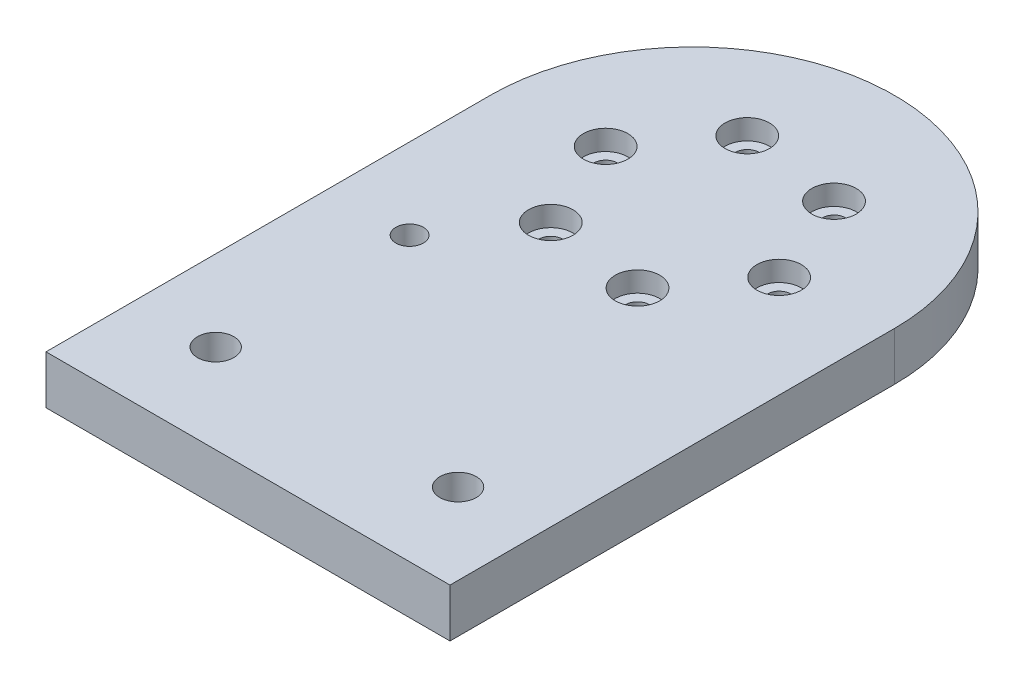
ISO-10303-21;
HEADER;
FILE_DESCRIPTION(('STEP AP214'),'2;1');
FILE_NAME('part.step','',(''),(''),'','','');
FILE_SCHEMA(('AUTOMOTIVE_DESIGN { 1 0 10303 214 1 1 1 1 }'));
ENDSEC;
DATA;
#1=APPLICATION_CONTEXT('core data for automotive mechanical design processes');
#2=APPLICATION_PROTOCOL_DEFINITION('international standard','automotive_design',2000,#1);
#3=PRODUCT_CONTEXT('',#1,'mechanical');
#4=PRODUCT('Part','Part','',(#3));
#5=PRODUCT_RELATED_PRODUCT_CATEGORY('part','',(#4));
#6=PRODUCT_DEFINITION_FORMATION('','',#4);
#7=PRODUCT_DEFINITION_CONTEXT('part definition',#1,'design');
#8=PRODUCT_DEFINITION('design','',#6,#7);
#9=PRODUCT_DEFINITION_SHAPE('','',#8);
#10=(LENGTH_UNIT() NAMED_UNIT(*) SI_UNIT(.MILLI.,.METRE.));
#11=(NAMED_UNIT(*) PLANE_ANGLE_UNIT() SI_UNIT($,.RADIAN.));
#12=(NAMED_UNIT(*) SI_UNIT($,.STERADIAN.) SOLID_ANGLE_UNIT());
#13=UNCERTAINTY_MEASURE_WITH_UNIT(LENGTH_MEASURE(1.E-05),#10,'distance_accuracy_value','');
#14=(GEOMETRIC_REPRESENTATION_CONTEXT(3) GLOBAL_UNCERTAINTY_ASSIGNED_CONTEXT((#13)) GLOBAL_UNIT_ASSIGNED_CONTEXT((#10,
#11,#12)) REPRESENTATION_CONTEXT('',''));
#15=CARTESIAN_POINT('',(0.,0.,0.));
#16=DIRECTION('',(0.,0.,1.));
#17=DIRECTION('',(1.,0.,0.));
#18=AXIS2_PLACEMENT_3D('',#15,#16,#17);
#19=CARTESIAN_POINT('',(4.76337970437843,40.5,501.556825420154));
#20=DIRECTION('',(0.,-1.,0.));
#21=DIRECTION('',(0.,0.,-1.));
#22=AXIS2_PLACEMENT_3D('',#19,#20,#21);
#23=CYLINDRICAL_SURFACE('',#22,1.45);
#24=CARTESIAN_POINT('',(4.76337970437843,34.5,501.556825420154));
#25=DIRECTION('',(0.,1.,0.));
#26=DIRECTION('',(0.,0.,1.));
#27=AXIS2_PLACEMENT_3D('',#24,#25,#26);
#28=CIRCLE('',#27,1.45);
#29=CARTESIAN_POINT('',(4.76337970437843,34.5,503.006825420154));
#30=VERTEX_POINT('',#29);
#31=EDGE_CURVE('E172',#30,#30,#28,.T.);
#32=ORIENTED_EDGE('',*,*,#31,.F.);
#33=EDGE_LOOP('',(#32));
#34=FACE_BOUND('',#33,.T.);
#35=CARTESIAN_POINT('',(4.76337970437843,38.,501.556825420154));
#36=DIRECTION('',(0.,1.,0.));
#37=DIRECTION('',(0.,0.,1.));
#38=AXIS2_PLACEMENT_3D('',#35,#36,#37);
#39=CIRCLE('',#38,1.45);
#40=CARTESIAN_POINT('',(4.76337970437843,38.,503.006825420154));
#41=VERTEX_POINT('',#40);
#42=EDGE_CURVE('E50',#41,#41,#39,.T.);
#43=ORIENTED_EDGE('',*,*,#42,.T.);
#44=EDGE_LOOP('',(#43));
#45=FACE_BOUND('',#44,.T.);
#46=ADVANCED_FACE('F43',(#34,#45),#23,.F.);
#47=CARTESIAN_POINT('',(-7.62681454876585,40.5,499.90362054194));
#48=DIRECTION('',(0.,-1.,0.));
#49=DIRECTION('',(0.,0.,-1.));
#50=AXIS2_PLACEMENT_3D('',#47,#48,#49);
#51=CYLINDRICAL_SURFACE('',#50,1.45);
#52=CARTESIAN_POINT('',(-7.62681454876585,34.5,499.90362054194));
#53=DIRECTION('',(0.,1.,0.));
#54=DIRECTION('',(0.,0.,1.));
#55=AXIS2_PLACEMENT_3D('',#52,#53,#54);
#56=CIRCLE('',#55,1.45);
#57=CARTESIAN_POINT('',(-7.62681454876585,34.5,501.35362054194));
#58=VERTEX_POINT('',#57);
#59=EDGE_CURVE('E181',#58,#58,#56,.T.);
#60=ORIENTED_EDGE('',*,*,#59,.F.);
#61=EDGE_LOOP('',(#60));
#62=FACE_BOUND('',#61,.T.);
#63=CARTESIAN_POINT('',(-7.62681454876585,38.,499.90362054194));
#64=DIRECTION('',(0.,1.,0.));
#65=DIRECTION('',(0.,0.,1.));
#66=AXIS2_PLACEMENT_3D('',#63,#64,#65);
#67=CIRCLE('',#66,1.45);
#68=CARTESIAN_POINT('',(-7.62681454876585,38.,501.35362054194));
#69=VERTEX_POINT('',#68);
#70=EDGE_CURVE('E225',#69,#69,#67,.T.);
#71=ORIENTED_EDGE('',*,*,#70,.T.);
#72=EDGE_LOOP('',(#71));
#73=FACE_BOUND('',#72,.T.);
#74=ADVANCED_FACE('F253',(#62,#73),#51,.F.);
#75=CARTESIAN_POINT('',(-12.3901942531443,40.5,488.346795121786));
#76=DIRECTION('',(0.,-1.,0.));
#77=DIRECTION('',(0.,0.,-1.));
#78=AXIS2_PLACEMENT_3D('',#75,#76,#77);
#79=CYLINDRICAL_SURFACE('',#78,1.45);
#80=CARTESIAN_POINT('',(-12.3901942531443,34.5,488.346795121786));
#81=DIRECTION('',(0.,1.,0.));
#82=DIRECTION('',(0.,0.,1.));
#83=AXIS2_PLACEMENT_3D('',#80,#81,#82);
#84=CIRCLE('',#83,1.45);
#85=CARTESIAN_POINT('',(-12.3901942531443,34.5,489.796795121786));
#86=VERTEX_POINT('',#85);
#87=EDGE_CURVE('E190',#86,#86,#84,.T.);
#88=ORIENTED_EDGE('',*,*,#87,.F.);
#89=EDGE_LOOP('',(#88));
#90=FACE_BOUND('',#89,.T.);
#91=CARTESIAN_POINT('',(-12.3901942531443,38.,488.346795121786));
#92=DIRECTION('',(0.,1.,0.));
#93=DIRECTION('',(0.,0.,1.));
#94=AXIS2_PLACEMENT_3D('',#91,#92,#93);
#95=CIRCLE('',#94,1.45);
#96=CARTESIAN_POINT('',(-12.3901942531443,38.,489.796795121786));
#97=VERTEX_POINT('',#96);
#98=EDGE_CURVE('E218',#97,#97,#95,.T.);
#99=ORIENTED_EDGE('',*,*,#98,.T.);
#100=EDGE_LOOP('',(#99));
#101=FACE_BOUND('',#100,.T.);
#102=ADVANCED_FACE('F258',(#90,#101),#79,.F.);
#103=CARTESIAN_POINT('',(-4.76337970437842,40.5,478.443174579846));
#104=DIRECTION('',(0.,-1.,0.));
#105=DIRECTION('',(0.,0.,-1.));
#106=AXIS2_PLACEMENT_3D('',#103,#104,#105);
#107=CYLINDRICAL_SURFACE('',#106,1.45);
#108=CARTESIAN_POINT('',(-4.76337970437842,34.5,478.443174579846));
#109=DIRECTION('',(0.,1.,0.));
#110=DIRECTION('',(0.,0.,1.));
#111=AXIS2_PLACEMENT_3D('',#108,#109,#110);
#112=CIRCLE('',#111,1.45);
#113=CARTESIAN_POINT('',(-4.76337970437842,34.5,479.893174579846));
#114=VERTEX_POINT('',#113);
#115=EDGE_CURVE('E179',#114,#114,#112,.T.);
#116=ORIENTED_EDGE('',*,*,#115,.F.);
#117=EDGE_LOOP('',(#116));
#118=FACE_BOUND('',#117,.T.);
#119=CARTESIAN_POINT('',(-4.76337970437842,38.,478.443174579846));
#120=DIRECTION('',(0.,1.,0.));
#121=DIRECTION('',(0.,0.,1.));
#122=AXIS2_PLACEMENT_3D('',#119,#120,#121);
#123=CIRCLE('',#122,1.45);
#124=CARTESIAN_POINT('',(-4.76337970437842,38.,479.893174579846));
#125=VERTEX_POINT('',#124);
#126=EDGE_CURVE('E214',#125,#125,#123,.T.);
#127=ORIENTED_EDGE('',*,*,#126,.T.);
#128=EDGE_LOOP('',(#127));
#129=FACE_BOUND('',#128,.T.);
#130=ADVANCED_FACE('F266',(#118,#129),#107,.F.);
#131=CARTESIAN_POINT('',(7.62681454876585,40.5,480.09637945806));
#132=DIRECTION('',(0.,-1.,0.));
#133=DIRECTION('',(0.,0.,-1.));
#134=AXIS2_PLACEMENT_3D('',#131,#132,#133);
#135=CYLINDRICAL_SURFACE('',#134,1.45);
#136=CARTESIAN_POINT('',(7.62681454876585,34.5,480.09637945806));
#137=DIRECTION('',(0.,1.,0.));
#138=DIRECTION('',(0.,0.,1.));
#139=AXIS2_PLACEMENT_3D('',#136,#137,#138);
#140=CIRCLE('',#139,1.45);
#141=CARTESIAN_POINT('',(7.62681454876585,34.5,481.54637945806));
#142=VERTEX_POINT('',#141);
#143=EDGE_CURVE('E178',#142,#142,#140,.T.);
#144=ORIENTED_EDGE('',*,*,#143,.F.);
#145=EDGE_LOOP('',(#144));
#146=FACE_BOUND('',#145,.T.);
#147=CARTESIAN_POINT('',(7.62681454876585,38.,480.09637945806));
#148=DIRECTION('',(0.,1.,0.));
#149=DIRECTION('',(0.,0.,1.));
#150=AXIS2_PLACEMENT_3D('',#147,#148,#149);
#151=CIRCLE('',#150,1.45);
#152=CARTESIAN_POINT('',(7.62681454876585,38.,481.54637945806));
#153=VERTEX_POINT('',#152);
#154=EDGE_CURVE('E211',#153,#153,#151,.T.);
#155=ORIENTED_EDGE('',*,*,#154,.T.);
#156=EDGE_LOOP('',(#155));
#157=FACE_BOUND('',#156,.T.);
#158=ADVANCED_FACE('F261',(#146,#157),#135,.F.);
#159=CARTESIAN_POINT('',(12.3901942531443,40.5,491.653204878214));
#160=DIRECTION('',(0.,-1.,0.));
#161=DIRECTION('',(0.,0.,-1.));
#162=AXIS2_PLACEMENT_3D('',#159,#160,#161);
#163=CYLINDRICAL_SURFACE('',#162,1.45);
#164=CARTESIAN_POINT('',(12.3901942531443,34.5,491.653204878214));
#165=DIRECTION('',(0.,1.,0.));
#166=DIRECTION('',(0.,0.,1.));
#167=AXIS2_PLACEMENT_3D('',#164,#165,#166);
#168=CIRCLE('',#167,1.45);
#169=CARTESIAN_POINT('',(12.3901942531443,34.5,493.103204878214));
#170=VERTEX_POINT('',#169);
#171=EDGE_CURVE('E173',#170,#170,#168,.T.);
#172=ORIENTED_EDGE('',*,*,#171,.F.);
#173=EDGE_LOOP('',(#172));
#174=FACE_BOUND('',#173,.T.);
#175=CARTESIAN_POINT('',(12.3901942531443,38.,491.653204878214));
#176=DIRECTION('',(0.,1.,0.));
#177=DIRECTION('',(0.,0.,1.));
#178=AXIS2_PLACEMENT_3D('',#175,#176,#177);
#179=CIRCLE('',#178,1.45);
#180=CARTESIAN_POINT('',(12.3901942531443,38.,493.103204878214));
#181=VERTEX_POINT('',#180);
#182=EDGE_CURVE('E170',#181,#181,#179,.T.);
#183=ORIENTED_EDGE('',*,*,#182,.T.);
#184=EDGE_LOOP('',(#183));
#185=FACE_BOUND('',#184,.T.);
#186=ADVANCED_FACE('F284',(#174,#185),#163,.F.);
#187=CARTESIAN_POINT('',(25.,40.5,526.));
#188=DIRECTION('',(-1.,0.,0.));
#189=DIRECTION('',(0.,0.,1.));
#190=AXIS2_PLACEMENT_3D('',#187,#188,#189);
#191=PLANE('',#190);
#192=DIRECTION('',(0.,0.,-1.));
#193=VECTOR('',#192,1.);
#194=CARTESIAN_POINT('',(25.,34.5,526.));
#195=LINE('',#194,#193);
#196=CARTESIAN_POINT('',(25.,34.5,545.));
#197=VERTEX_POINT('',#196);
#198=CARTESIAN_POINT('',(25.,34.5,490.));
#199=VERTEX_POINT('',#198);
#200=EDGE_CURVE('E198',#197,#199,#195,.T.);
#201=ORIENTED_EDGE('',*,*,#200,.T.);
#202=DIRECTION('',(0.,-1.,0.));
#203=VECTOR('',#202,1.);
#204=CARTESIAN_POINT('',(25.,40.5,490.));
#205=LINE('',#204,#203);
#206=CARTESIAN_POINT('',(25.,40.5,490.));
#207=VERTEX_POINT('',#206);
#208=EDGE_CURVE('E11',#207,#199,#205,.T.);
#209=ORIENTED_EDGE('',*,*,#208,.F.);
#210=DIRECTION('',(0.,0.,-1.));
#211=VECTOR('',#210,1.);
#212=CARTESIAN_POINT('',(25.,40.5,526.));
#213=LINE('',#212,#211);
#214=CARTESIAN_POINT('',(25.,40.5,545.));
#215=VERTEX_POINT('',#214);
#216=EDGE_CURVE('E94',#215,#207,#213,.T.);
#217=ORIENTED_EDGE('',*,*,#216,.F.);
#218=DIRECTION('',(0.,-1.,0.));
#219=VECTOR('',#218,1.);
#220=CARTESIAN_POINT('',(25.,40.5,545.));
#221=LINE('',#220,#219);
#222=EDGE_CURVE('E106',#215,#197,#221,.T.);
#223=ORIENTED_EDGE('',*,*,#222,.T.);
#224=EDGE_LOOP('',(#201,#209,#217,#223));
#225=FACE_BOUND('',#224,.T.);
#226=ADVANCED_FACE('F44',(#225),#191,.F.);
#227=CARTESIAN_POINT('',(-25.,40.5,526.));
#228=DIRECTION('',(1.,0.,0.));
#229=DIRECTION('',(0.,0.,-1.));
#230=AXIS2_PLACEMENT_3D('',#227,#228,#229);
#231=PLANE('',#230);
#232=DIRECTION('',(0.,0.,1.));
#233=VECTOR('',#232,1.);
#234=CARTESIAN_POINT('',(-25.,34.5,526.));
#235=LINE('',#234,#233);
#236=CARTESIAN_POINT('',(-25.,34.5,490.));
#237=VERTEX_POINT('',#236);
#238=CARTESIAN_POINT('',(-25.,34.5,545.));
#239=VERTEX_POINT('',#238);
#240=EDGE_CURVE('E99',#237,#239,#235,.T.);
#241=ORIENTED_EDGE('',*,*,#240,.T.);
#242=DIRECTION('',(0.,-1.,0.));
#243=VECTOR('',#242,1.);
#244=CARTESIAN_POINT('',(-25.,40.5,545.));
#245=LINE('',#244,#243);
#246=CARTESIAN_POINT('',(-25.,40.5,545.));
#247=VERTEX_POINT('',#246);
#248=EDGE_CURVE('E100',#247,#239,#245,.T.);
#249=ORIENTED_EDGE('',*,*,#248,.F.);
#250=DIRECTION('',(0.,0.,1.));
#251=VECTOR('',#250,1.);
#252=CARTESIAN_POINT('',(-25.,40.5,526.));
#253=LINE('',#252,#251);
#254=CARTESIAN_POINT('',(-25.,40.5,490.));
#255=VERTEX_POINT('',#254);
#256=EDGE_CURVE('E84',#255,#247,#253,.T.);
#257=ORIENTED_EDGE('',*,*,#256,.F.);
#258=DIRECTION('',(0.,-1.,0.));
#259=VECTOR('',#258,1.);
#260=CARTESIAN_POINT('',(-25.,40.5,490.));
#261=LINE('',#260,#259);
#262=EDGE_CURVE('E52',#255,#237,#261,.T.);
#263=ORIENTED_EDGE('',*,*,#262,.T.);
#264=EDGE_LOOP('',(#241,#249,#257,#263));
#265=FACE_BOUND('',#264,.T.);
#266=ADVANCED_FACE('F98',(#265),#231,.F.);
#267=CARTESIAN_POINT('',(0.,40.5,0.));
#268=DIRECTION('',(0.,-1.,0.));
#269=DIRECTION('',(0.,0.,-1.));
#270=AXIS2_PLACEMENT_3D('',#267,#268,#269);
#271=PLANE('',#270);
#272=CARTESIAN_POINT('',(-15.,40.5,510.));
#273=DIRECTION('',(0.,1.,0.));
#274=DIRECTION('',(0.,0.,1.));
#275=AXIS2_PLACEMENT_3D('',#272,#273,#274);
#276=CIRCLE('',#275,1.7);
#277=CARTESIAN_POINT('',(-15.,40.5,511.7));
#278=VERTEX_POINT('',#277);
#279=EDGE_CURVE('E366',#278,#278,#276,.T.);
#280=ORIENTED_EDGE('',*,*,#279,.F.);
#281=EDGE_LOOP('',(#280));
#282=FACE_BOUND('',#281,.T.);
#283=CARTESIAN_POINT('',(-15.,40.5,534.));
#284=DIRECTION('',(0.,1.,0.));
#285=DIRECTION('',(0.,0.,1.));
#286=AXIS2_PLACEMENT_3D('',#283,#284,#285);
#287=CIRCLE('',#286,2.25);
#288=CARTESIAN_POINT('',(-15.,40.5,536.25));
#289=VERTEX_POINT('',#288);
#290=EDGE_CURVE('E116',#289,#289,#287,.T.);
#291=ORIENTED_EDGE('',*,*,#290,.F.);
#292=EDGE_LOOP('',(#291));
#293=FACE_BOUND('',#292,.T.);
#294=CARTESIAN_POINT('',(15.,40.5,534.));
#295=DIRECTION('',(0.,1.,0.));
#296=DIRECTION('',(0.,0.,1.));
#297=AXIS2_PLACEMENT_3D('',#294,#295,#296);
#298=CIRCLE('',#297,2.25);
#299=CARTESIAN_POINT('',(15.,40.5,536.25));
#300=VERTEX_POINT('',#299);
#301=EDGE_CURVE('E123',#300,#300,#298,.T.);
#302=ORIENTED_EDGE('',*,*,#301,.F.);
#303=EDGE_LOOP('',(#302));
#304=FACE_BOUND('',#303,.T.);
#305=CARTESIAN_POINT('',(4.76337970437843,40.5,501.556825420154));
#306=DIRECTION('',(0.,1.,0.));
#307=DIRECTION('',(0.,0.,1.));
#308=AXIS2_PLACEMENT_3D('',#305,#306,#307);
#309=CIRCLE('',#308,2.75);
#310=CARTESIAN_POINT('',(4.76337970437843,40.5,504.306825420154));
#311=VERTEX_POINT('',#310);
#312=EDGE_CURVE('E140',#311,#311,#309,.T.);
#313=ORIENTED_EDGE('',*,*,#312,.F.);
#314=EDGE_LOOP('',(#313));
#315=FACE_BOUND('',#314,.T.);
#316=CARTESIAN_POINT('',(-7.62681454876585,40.5,499.90362054194));
#317=DIRECTION('',(0.,1.,0.));
#318=DIRECTION('',(0.,0.,1.));
#319=AXIS2_PLACEMENT_3D('',#316,#317,#318);
#320=CIRCLE('',#319,2.75);
#321=CARTESIAN_POINT('',(-7.62681454876585,40.5,502.65362054194));
#322=VERTEX_POINT('',#321);
#323=EDGE_CURVE('E144',#322,#322,#320,.T.);
#324=ORIENTED_EDGE('',*,*,#323,.F.);
#325=EDGE_LOOP('',(#324));
#326=FACE_BOUND('',#325,.T.);
#327=CARTESIAN_POINT('',(-12.3901942531443,40.5,488.346795121786));
#328=DIRECTION('',(0.,1.,0.));
#329=DIRECTION('',(0.,0.,1.));
#330=AXIS2_PLACEMENT_3D('',#327,#328,#329);
#331=CIRCLE('',#330,2.75);
#332=CARTESIAN_POINT('',(-12.3901942531443,40.5,491.096795121786));
#333=VERTEX_POINT('',#332);
#334=EDGE_CURVE('E153',#333,#333,#331,.T.);
#335=ORIENTED_EDGE('',*,*,#334,.F.);
#336=EDGE_LOOP('',(#335));
#337=FACE_BOUND('',#336,.T.);
#338=CARTESIAN_POINT('',(-4.76337970437842,40.5,478.443174579846));
#339=DIRECTION('',(0.,1.,0.));
#340=DIRECTION('',(0.,0.,1.));
#341=AXIS2_PLACEMENT_3D('',#338,#339,#340);
#342=CIRCLE('',#341,2.75);
#343=CARTESIAN_POINT('',(-4.76337970437842,40.5,481.193174579846));
#344=VERTEX_POINT('',#343);
#345=EDGE_CURVE('E126',#344,#344,#342,.T.);
#346=ORIENTED_EDGE('',*,*,#345,.F.);
#347=EDGE_LOOP('',(#346));
#348=FACE_BOUND('',#347,.T.);
#349=CARTESIAN_POINT('',(7.62681454876585,40.5,480.09637945806));
#350=DIRECTION('',(0.,1.,0.));
#351=DIRECTION('',(0.,0.,1.));
#352=AXIS2_PLACEMENT_3D('',#349,#350,#351);
#353=CIRCLE('',#352,2.75);
#354=CARTESIAN_POINT('',(7.62681454876585,40.5,482.84637945806));
#355=VERTEX_POINT('',#354);
#356=EDGE_CURVE('E104',#355,#355,#353,.T.);
#357=ORIENTED_EDGE('',*,*,#356,.F.);
#358=EDGE_LOOP('',(#357));
#359=FACE_BOUND('',#358,.T.);
#360=CARTESIAN_POINT('',(12.3901942531443,40.5,491.653204878214));
#361=DIRECTION('',(0.,1.,0.));
#362=DIRECTION('',(0.,0.,1.));
#363=AXIS2_PLACEMENT_3D('',#360,#361,#362);
#364=CIRCLE('',#363,2.75);
#365=CARTESIAN_POINT('',(12.3901942531443,40.5,494.403204878214));
#366=VERTEX_POINT('',#365);
#367=EDGE_CURVE('E162',#366,#366,#364,.T.);
#368=ORIENTED_EDGE('',*,*,#367,.F.);
#369=EDGE_LOOP('',(#368));
#370=FACE_BOUND('',#369,.T.);
#371=ORIENTED_EDGE('',*,*,#216,.T.);
#372=CARTESIAN_POINT('',(0.,40.5,490.));
#373=DIRECTION('',(0.,1.,0.));
#374=DIRECTION('',(0.,0.,1.));
#375=AXIS2_PLACEMENT_3D('',#372,#373,#374);
#376=CIRCLE('',#375,25.);
#377=EDGE_CURVE('E93',#207,#255,#376,.T.);
#378=ORIENTED_EDGE('',*,*,#377,.T.);
#379=ORIENTED_EDGE('',*,*,#256,.T.);
#380=DIRECTION('',(1.,0.,0.));
#381=VECTOR('',#380,1.);
#382=CARTESIAN_POINT('',(-25.,40.5,545.));
#383=LINE('',#382,#381);
#384=EDGE_CURVE('E90',#247,#215,#383,.T.);
#385=ORIENTED_EDGE('',*,*,#384,.T.);
#386=EDGE_LOOP('',(#371,#378,#379,#385));
#387=FACE_BOUND('',#386,.T.);
#388=ADVANCED_FACE('F87',(#282,#293,#304,#315,#326,#337,#348,#359,#370,#387),#271,.F.);
#389=CARTESIAN_POINT('',(0.,34.5,0.));
#390=DIRECTION('',(0.,-1.,0.));
#391=DIRECTION('',(0.,0.,-1.));
#392=AXIS2_PLACEMENT_3D('',#389,#390,#391);
#393=PLANE('',#392);
#394=CARTESIAN_POINT('',(-15.,34.5,510.));
#395=DIRECTION('',(0.,1.,0.));
#396=DIRECTION('',(0.,0.,1.));
#397=AXIS2_PLACEMENT_3D('',#394,#395,#396);
#398=CIRCLE('',#397,1.7);
#399=CARTESIAN_POINT('',(-15.,34.5,511.7));
#400=VERTEX_POINT('',#399);
#401=EDGE_CURVE('E371',#400,#400,#398,.T.);
#402=ORIENTED_EDGE('',*,*,#401,.T.);
#403=EDGE_LOOP('',(#402));
#404=FACE_BOUND('',#403,.T.);
#405=CARTESIAN_POINT('',(-15.,34.5,534.));
#406=DIRECTION('',(0.,1.,0.));
#407=DIRECTION('',(0.,0.,1.));
#408=AXIS2_PLACEMENT_3D('',#405,#406,#407);
#409=CIRCLE('',#408,2.25);
#410=CARTESIAN_POINT('',(-15.,34.5,536.25));
#411=VERTEX_POINT('',#410);
#412=EDGE_CURVE('E379',#411,#411,#409,.T.);
#413=ORIENTED_EDGE('',*,*,#412,.T.);
#414=EDGE_LOOP('',(#413));
#415=FACE_BOUND('',#414,.T.);
#416=CARTESIAN_POINT('',(15.,34.5,534.));
#417=DIRECTION('',(0.,1.,0.));
#418=DIRECTION('',(0.,0.,1.));
#419=AXIS2_PLACEMENT_3D('',#416,#417,#418);
#420=CIRCLE('',#419,2.25);
#421=CARTESIAN_POINT('',(15.,34.5,536.25));
#422=VERTEX_POINT('',#421);
#423=EDGE_CURVE('E382',#422,#422,#420,.T.);
#424=ORIENTED_EDGE('',*,*,#423,.T.);
#425=EDGE_LOOP('',(#424));
#426=FACE_BOUND('',#425,.T.);
#427=ORIENTED_EDGE('',*,*,#171,.T.);
#428=EDGE_LOOP('',(#427));
#429=FACE_BOUND('',#428,.T.);
#430=ORIENTED_EDGE('',*,*,#143,.T.);
#431=EDGE_LOOP('',(#430));
#432=FACE_BOUND('',#431,.T.);
#433=ORIENTED_EDGE('',*,*,#115,.T.);
#434=EDGE_LOOP('',(#433));
#435=FACE_BOUND('',#434,.T.);
#436=ORIENTED_EDGE('',*,*,#87,.T.);
#437=EDGE_LOOP('',(#436));
#438=FACE_BOUND('',#437,.T.);
#439=ORIENTED_EDGE('',*,*,#59,.T.);
#440=EDGE_LOOP('',(#439));
#441=FACE_BOUND('',#440,.T.);
#442=ORIENTED_EDGE('',*,*,#31,.T.);
#443=EDGE_LOOP('',(#442));
#444=FACE_BOUND('',#443,.T.);
#445=ORIENTED_EDGE('',*,*,#240,.F.);
#446=CARTESIAN_POINT('',(0.,34.5,490.));
#447=DIRECTION('',(0.,1.,0.));
#448=DIRECTION('',(0.,0.,1.));
#449=AXIS2_PLACEMENT_3D('',#446,#447,#448);
#450=CIRCLE('',#449,25.);
#451=EDGE_CURVE('E58',#199,#237,#450,.T.);
#452=ORIENTED_EDGE('',*,*,#451,.F.);
#453=ORIENTED_EDGE('',*,*,#200,.F.);
#454=DIRECTION('',(1.,0.,0.));
#455=VECTOR('',#454,1.);
#456=CARTESIAN_POINT('',(-25.,34.5,545.));
#457=LINE('',#456,#455);
#458=EDGE_CURVE('E112',#239,#197,#457,.T.);
#459=ORIENTED_EDGE('',*,*,#458,.F.);
#460=EDGE_LOOP('',(#445,#452,#453,#459));
#461=FACE_BOUND('',#460,.T.);
#462=ADVANCED_FACE('F274',(#404,#415,#426,#429,#432,#435,#438,#441,#444,#461),#393,.T.);
#463=CARTESIAN_POINT('',(0.,40.5,490.));
#464=DIRECTION('',(0.,-1.,0.));
#465=DIRECTION('',(0.,0.,-1.));
#466=AXIS2_PLACEMENT_3D('',#463,#464,#465);
#467=CYLINDRICAL_SURFACE('',#466,25.);
#468=ORIENTED_EDGE('',*,*,#377,.F.);
#469=ORIENTED_EDGE('',*,*,#208,.T.);
#470=ORIENTED_EDGE('',*,*,#451,.T.);
#471=ORIENTED_EDGE('',*,*,#262,.F.);
#472=EDGE_LOOP('',(#468,#469,#470,#471));
#473=FACE_BOUND('',#472,.T.);
#474=ADVANCED_FACE('F271',(#473),#467,.T.);
#475=CARTESIAN_POINT('',(12.3901942531443,40.5,491.653204878214));
#476=DIRECTION('',(0.,-1.,0.));
#477=DIRECTION('',(0.,0.,-1.));
#478=AXIS2_PLACEMENT_3D('',#475,#476,#477);
#479=CYLINDRICAL_SURFACE('',#478,2.75);
#480=ORIENTED_EDGE('',*,*,#367,.T.);
#481=EDGE_LOOP('',(#480));
#482=FACE_BOUND('',#481,.T.);
#483=CARTESIAN_POINT('',(12.3901942531443,38.,491.653204878214));
#484=DIRECTION('',(0.,1.,0.));
#485=DIRECTION('',(0.,0.,1.));
#486=AXIS2_PLACEMENT_3D('',#483,#484,#485);
#487=CIRCLE('',#486,2.75);
#488=CARTESIAN_POINT('',(12.3901942531443,38.,494.403204878214));
#489=VERTEX_POINT('',#488);
#490=EDGE_CURVE('E138',#489,#489,#487,.T.);
#491=ORIENTED_EDGE('',*,*,#490,.F.);
#492=EDGE_LOOP('',(#491));
#493=FACE_BOUND('',#492,.T.);
#494=ADVANCED_FACE('F273',(#482,#493),#479,.F.);
#495=CARTESIAN_POINT('',(12.3901942531443,38.,491.653204878214));
#496=DIRECTION('',(0.,1.,0.));
#497=DIRECTION('',(0.,0.,1.));
#498=AXIS2_PLACEMENT_3D('',#495,#496,#497);
#499=PLANE('',#498);
#500=ORIENTED_EDGE('',*,*,#182,.F.);
#501=EDGE_LOOP('',(#500));
#502=FACE_BOUND('',#501,.T.);
#503=ORIENTED_EDGE('',*,*,#490,.T.);
#504=EDGE_LOOP('',(#503));
#505=FACE_BOUND('',#504,.T.);
#506=ADVANCED_FACE('F296',(#502,#505),#499,.T.);
#507=CARTESIAN_POINT('',(7.62681454876585,40.5,480.09637945806));
#508=DIRECTION('',(0.,-1.,0.));
#509=DIRECTION('',(0.,0.,-1.));
#510=AXIS2_PLACEMENT_3D('',#507,#508,#509);
#511=CYLINDRICAL_SURFACE('',#510,2.75);
#512=ORIENTED_EDGE('',*,*,#356,.T.);
#513=EDGE_LOOP('',(#512));
#514=FACE_BOUND('',#513,.T.);
#515=CARTESIAN_POINT('',(7.62681454876585,38.,480.09637945806));
#516=DIRECTION('',(0.,1.,0.));
#517=DIRECTION('',(0.,0.,1.));
#518=AXIS2_PLACEMENT_3D('',#515,#516,#517);
#519=CIRCLE('',#518,2.75);
#520=CARTESIAN_POINT('',(7.62681454876585,38.,482.84637945806));
#521=VERTEX_POINT('',#520);
#522=EDGE_CURVE('E124',#521,#521,#519,.T.);
#523=ORIENTED_EDGE('',*,*,#522,.F.);
#524=EDGE_LOOP('',(#523));
#525=FACE_BOUND('',#524,.T.);
#526=ADVANCED_FACE('F305',(#514,#525),#511,.F.);
#527=CARTESIAN_POINT('',(7.62681454876585,38.,480.09637945806));
#528=DIRECTION('',(0.,1.,0.));
#529=DIRECTION('',(0.,0.,1.));
#530=AXIS2_PLACEMENT_3D('',#527,#528,#529);
#531=PLANE('',#530);
#532=ORIENTED_EDGE('',*,*,#154,.F.);
#533=EDGE_LOOP('',(#532));
#534=FACE_BOUND('',#533,.T.);
#535=ORIENTED_EDGE('',*,*,#522,.T.);
#536=EDGE_LOOP('',(#535));
#537=FACE_BOUND('',#536,.T.);
#538=ADVANCED_FACE('F315',(#534,#537),#531,.T.);
#539=CARTESIAN_POINT('',(-4.76337970437842,40.5,478.443174579846));
#540=DIRECTION('',(0.,-1.,0.));
#541=DIRECTION('',(0.,0.,-1.));
#542=AXIS2_PLACEMENT_3D('',#539,#540,#541);
#543=CYLINDRICAL_SURFACE('',#542,2.75);
#544=ORIENTED_EDGE('',*,*,#345,.T.);
#545=EDGE_LOOP('',(#544));
#546=FACE_BOUND('',#545,.T.);
#547=CARTESIAN_POINT('',(-4.76337970437842,38.,478.443174579846));
#548=DIRECTION('',(0.,1.,0.));
#549=DIRECTION('',(0.,0.,1.));
#550=AXIS2_PLACEMENT_3D('',#547,#548,#549);
#551=CIRCLE('',#550,2.75);
#552=CARTESIAN_POINT('',(-4.76337970437842,38.,481.193174579846));
#553=VERTEX_POINT('',#552);
#554=EDGE_CURVE('E160',#553,#553,#551,.T.);
#555=ORIENTED_EDGE('',*,*,#554,.F.);
#556=EDGE_LOOP('',(#555));
#557=FACE_BOUND('',#556,.T.);
#558=ADVANCED_FACE('F306',(#546,#557),#543,.F.);
#559=CARTESIAN_POINT('',(-4.76337970437842,38.,478.443174579846));
#560=DIRECTION('',(0.,1.,0.));
#561=DIRECTION('',(0.,0.,1.));
#562=AXIS2_PLACEMENT_3D('',#559,#560,#561);
#563=PLANE('',#562);
#564=ORIENTED_EDGE('',*,*,#126,.F.);
#565=EDGE_LOOP('',(#564));
#566=FACE_BOUND('',#565,.T.);
#567=ORIENTED_EDGE('',*,*,#554,.T.);
#568=EDGE_LOOP('',(#567));
#569=FACE_BOUND('',#568,.T.);
#570=ADVANCED_FACE('F304',(#566,#569),#563,.T.);
#571=CARTESIAN_POINT('',(-12.3901942531443,40.5,488.346795121786));
#572=DIRECTION('',(0.,-1.,0.));
#573=DIRECTION('',(0.,0.,-1.));
#574=AXIS2_PLACEMENT_3D('',#571,#572,#573);
#575=CYLINDRICAL_SURFACE('',#574,2.75);
#576=ORIENTED_EDGE('',*,*,#334,.T.);
#577=EDGE_LOOP('',(#576));
#578=FACE_BOUND('',#577,.T.);
#579=CARTESIAN_POINT('',(-12.3901942531443,38.,488.346795121786));
#580=DIRECTION('',(0.,1.,0.));
#581=DIRECTION('',(0.,0.,1.));
#582=AXIS2_PLACEMENT_3D('',#579,#580,#581);
#583=CIRCLE('',#582,2.75);
#584=CARTESIAN_POINT('',(-12.3901942531443,38.,491.096795121786));
#585=VERTEX_POINT('',#584);
#586=EDGE_CURVE('E149',#585,#585,#583,.T.);
#587=ORIENTED_EDGE('',*,*,#586,.F.);
#588=EDGE_LOOP('',(#587));
#589=FACE_BOUND('',#588,.T.);
#590=ADVANCED_FACE('F307',(#578,#589),#575,.F.);
#591=CARTESIAN_POINT('',(-12.3901942531443,38.,488.346795121786));
#592=DIRECTION('',(0.,1.,0.));
#593=DIRECTION('',(0.,0.,1.));
#594=AXIS2_PLACEMENT_3D('',#591,#592,#593);
#595=PLANE('',#594);
#596=ORIENTED_EDGE('',*,*,#98,.F.);
#597=EDGE_LOOP('',(#596));
#598=FACE_BOUND('',#597,.T.);
#599=ORIENTED_EDGE('',*,*,#586,.T.);
#600=EDGE_LOOP('',(#599));
#601=FACE_BOUND('',#600,.T.);
#602=ADVANCED_FACE('F314',(#598,#601),#595,.T.);
#603=CARTESIAN_POINT('',(-7.62681454876585,40.5,499.90362054194));
#604=DIRECTION('',(0.,-1.,0.));
#605=DIRECTION('',(0.,0.,-1.));
#606=AXIS2_PLACEMENT_3D('',#603,#604,#605);
#607=CYLINDRICAL_SURFACE('',#606,2.75);
#608=ORIENTED_EDGE('',*,*,#323,.T.);
#609=EDGE_LOOP('',(#608));
#610=FACE_BOUND('',#609,.T.);
#611=CARTESIAN_POINT('',(-7.62681454876585,38.,499.90362054194));
#612=DIRECTION('',(0.,1.,0.));
#613=DIRECTION('',(0.,0.,1.));
#614=AXIS2_PLACEMENT_3D('',#611,#612,#613);
#615=CIRCLE('',#614,2.75);
#616=CARTESIAN_POINT('',(-7.62681454876585,38.,502.65362054194));
#617=VERTEX_POINT('',#616);
#618=EDGE_CURVE('E143',#617,#617,#615,.T.);
#619=ORIENTED_EDGE('',*,*,#618,.F.);
#620=EDGE_LOOP('',(#619));
#621=FACE_BOUND('',#620,.T.);
#622=ADVANCED_FACE('F248',(#610,#621),#607,.F.);
#623=CARTESIAN_POINT('',(-7.62681454876585,38.,499.90362054194));
#624=DIRECTION('',(0.,1.,0.));
#625=DIRECTION('',(0.,0.,1.));
#626=AXIS2_PLACEMENT_3D('',#623,#624,#625);
#627=PLANE('',#626);
#628=ORIENTED_EDGE('',*,*,#70,.F.);
#629=EDGE_LOOP('',(#628));
#630=FACE_BOUND('',#629,.T.);
#631=ORIENTED_EDGE('',*,*,#618,.T.);
#632=EDGE_LOOP('',(#631));
#633=FACE_BOUND('',#632,.T.);
#634=ADVANCED_FACE('F243',(#630,#633),#627,.T.);
#635=CARTESIAN_POINT('',(4.76337970437843,40.5,501.556825420154));
#636=DIRECTION('',(0.,-1.,0.));
#637=DIRECTION('',(0.,0.,-1.));
#638=AXIS2_PLACEMENT_3D('',#635,#636,#637);
#639=CYLINDRICAL_SURFACE('',#638,2.75);
#640=ORIENTED_EDGE('',*,*,#312,.T.);
#641=EDGE_LOOP('',(#640));
#642=FACE_BOUND('',#641,.T.);
#643=CARTESIAN_POINT('',(4.76337970437843,38.,501.556825420154));
#644=DIRECTION('',(0.,1.,0.));
#645=DIRECTION('',(0.,0.,1.));
#646=AXIS2_PLACEMENT_3D('',#643,#644,#645);
#647=CIRCLE('',#646,2.75);
#648=CARTESIAN_POINT('',(4.76337970437843,38.,504.306825420154));
#649=VERTEX_POINT('',#648);
#650=EDGE_CURVE('E135',#649,#649,#647,.T.);
#651=ORIENTED_EDGE('',*,*,#650,.F.);
#652=EDGE_LOOP('',(#651));
#653=FACE_BOUND('',#652,.T.);
#654=ADVANCED_FACE('F237',(#642,#653),#639,.F.);
#655=CARTESIAN_POINT('',(4.76337970437843,38.,501.556825420154));
#656=DIRECTION('',(0.,1.,0.));
#657=DIRECTION('',(0.,0.,1.));
#658=AXIS2_PLACEMENT_3D('',#655,#656,#657);
#659=PLANE('',#658);
#660=ORIENTED_EDGE('',*,*,#42,.F.);
#661=EDGE_LOOP('',(#660));
#662=FACE_BOUND('',#661,.T.);
#663=ORIENTED_EDGE('',*,*,#650,.T.);
#664=EDGE_LOOP('',(#663));
#665=FACE_BOUND('',#664,.T.);
#666=ADVANCED_FACE('F231',(#662,#665),#659,.T.);
#667=CARTESIAN_POINT('',(-25.,40.5,545.));
#668=DIRECTION('',(0.,0.,-1.));
#669=DIRECTION('',(-1.,0.,0.));
#670=AXIS2_PLACEMENT_3D('',#667,#668,#669);
#671=PLANE('',#670);
#672=ORIENTED_EDGE('',*,*,#458,.T.);
#673=ORIENTED_EDGE('',*,*,#222,.F.);
#674=ORIENTED_EDGE('',*,*,#384,.F.);
#675=ORIENTED_EDGE('',*,*,#248,.T.);
#676=EDGE_LOOP('',(#672,#673,#674,#675));
#677=FACE_BOUND('',#676,.T.);
#678=ADVANCED_FACE('F107',(#677),#671,.F.);
#679=CARTESIAN_POINT('',(15.,40.5,534.));
#680=DIRECTION('',(0.,-1.,0.));
#681=DIRECTION('',(0.,0.,-1.));
#682=AXIS2_PLACEMENT_3D('',#679,#680,#681);
#683=CYLINDRICAL_SURFACE('',#682,2.25);
#684=ORIENTED_EDGE('',*,*,#301,.T.);
#685=EDGE_LOOP('',(#684));
#686=FACE_BOUND('',#685,.T.);
#687=ORIENTED_EDGE('',*,*,#423,.F.);
#688=EDGE_LOOP('',(#687));
#689=FACE_BOUND('',#688,.T.);
#690=ADVANCED_FACE('F351',(#686,#689),#683,.F.);
#691=CARTESIAN_POINT('',(-15.,40.5,534.));
#692=DIRECTION('',(0.,-1.,0.));
#693=DIRECTION('',(0.,0.,-1.));
#694=AXIS2_PLACEMENT_3D('',#691,#692,#693);
#695=CYLINDRICAL_SURFACE('',#694,2.25);
#696=ORIENTED_EDGE('',*,*,#290,.T.);
#697=EDGE_LOOP('',(#696));
#698=FACE_BOUND('',#697,.T.);
#699=ORIENTED_EDGE('',*,*,#412,.F.);
#700=EDGE_LOOP('',(#699));
#701=FACE_BOUND('',#700,.T.);
#702=ADVANCED_FACE('F358',(#698,#701),#695,.F.);
#703=CARTESIAN_POINT('',(-15.,40.5,510.));
#704=DIRECTION('',(0.,-1.,0.));
#705=DIRECTION('',(0.,0.,-1.));
#706=AXIS2_PLACEMENT_3D('',#703,#704,#705);
#707=CYLINDRICAL_SURFACE('',#706,1.7);
#708=ORIENTED_EDGE('',*,*,#279,.T.);
#709=EDGE_LOOP('',(#708));
#710=FACE_BOUND('',#709,.T.);
#711=ORIENTED_EDGE('',*,*,#401,.F.);
#712=EDGE_LOOP('',(#711));
#713=FACE_BOUND('',#712,.T.);
#714=ADVANCED_FACE('F357',(#710,#713),#707,.F.);
#715=CLOSED_SHELL('',(#46,#74,#102,#130,#158,#186,#226,#266,#388,#462,#474,#494,#506,#526,#538,
#558,#570,#590,#602,#622,#634,#654,#666,#678,#690,#702,#714));
#716=MANIFOLD_SOLID_BREP('B2',#715);
#717=ADVANCED_BREP_SHAPE_REPRESENTATION('',(#18,#716),#14);
#718=SHAPE_DEFINITION_REPRESENTATION(#9,#717);
ENDSEC;
END-ISO-10303-21;
